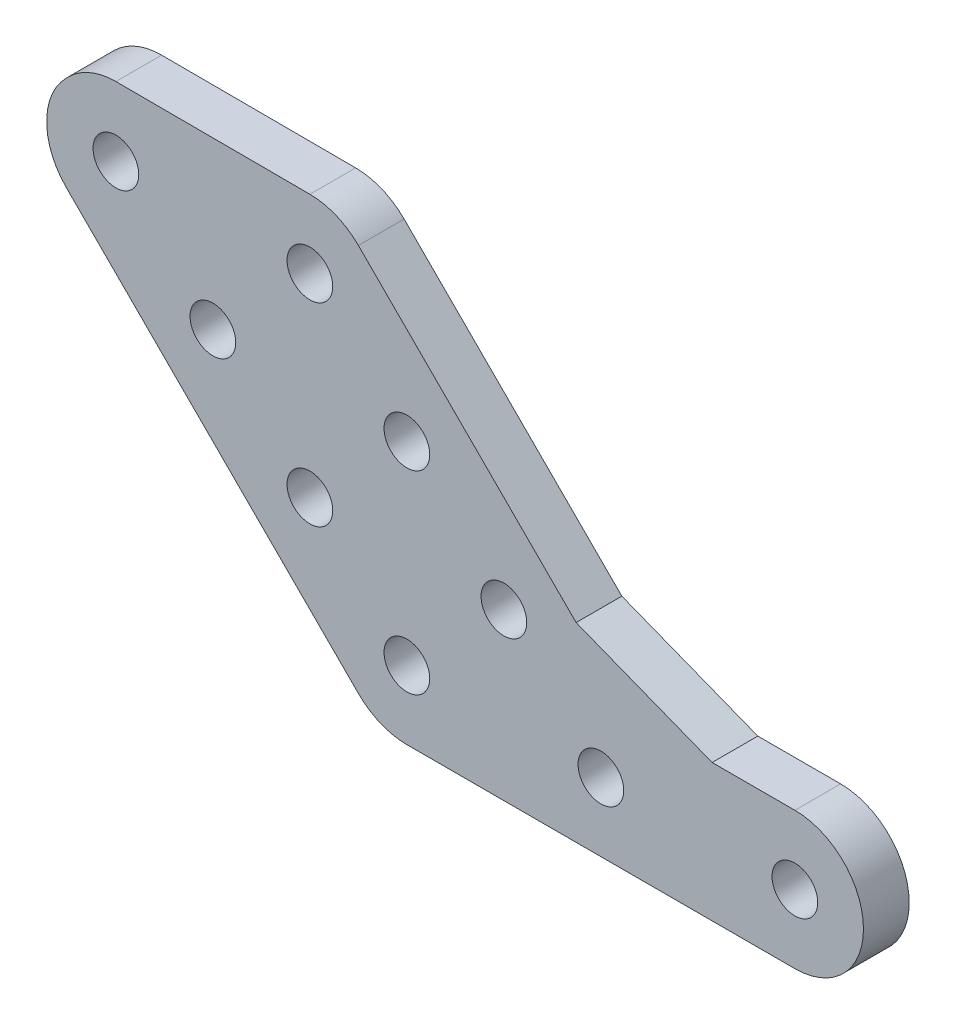
ISO-10303-21;
HEADER;
FILE_DESCRIPTION(('STEP AP214'),'2;1');
FILE_NAME('part.step','',(''),(''),'','','');
FILE_SCHEMA(('AUTOMOTIVE_DESIGN { 1 0 10303 214 1 1 1 1 }'));
ENDSEC;
DATA;
#1=APPLICATION_CONTEXT('core data for automotive mechanical design processes');
#2=APPLICATION_PROTOCOL_DEFINITION('international standard','automotive_design',2000,#1);
#3=PRODUCT_CONTEXT('',#1,'mechanical');
#4=PRODUCT('Part','Part','',(#3));
#5=PRODUCT_RELATED_PRODUCT_CATEGORY('part','',(#4));
#6=PRODUCT_DEFINITION_FORMATION('','',#4);
#7=PRODUCT_DEFINITION_CONTEXT('part definition',#1,'design');
#8=PRODUCT_DEFINITION('design','',#6,#7);
#9=PRODUCT_DEFINITION_SHAPE('','',#8);
#10=(LENGTH_UNIT() NAMED_UNIT(*) SI_UNIT(.MILLI.,.METRE.));
#11=(NAMED_UNIT(*) PLANE_ANGLE_UNIT() SI_UNIT($,.RADIAN.));
#12=(NAMED_UNIT(*) SI_UNIT($,.STERADIAN.) SOLID_ANGLE_UNIT());
#13=UNCERTAINTY_MEASURE_WITH_UNIT(LENGTH_MEASURE(1.E-05),#10,'distance_accuracy_value','');
#14=(GEOMETRIC_REPRESENTATION_CONTEXT(3) GLOBAL_UNCERTAINTY_ASSIGNED_CONTEXT((#13)) GLOBAL_UNIT_ASSIGNED_CONTEXT((#10,
#11,#12)) REPRESENTATION_CONTEXT('',''));
#15=CARTESIAN_POINT('',(0.,0.,0.));
#16=DIRECTION('',(0.,0.,1.));
#17=DIRECTION('',(1.,0.,0.));
#18=AXIS2_PLACEMENT_3D('',#15,#16,#17);
#19=CARTESIAN_POINT('',(237.5387643673,237.5387643673,3.));
#20=DIRECTION('',(0.707106781186548,0.707106781186547,0.));
#21=DIRECTION('',(-0.707106781186547,0.707106781186548,0.));
#22=AXIS2_PLACEMENT_3D('',#19,#20,#21);
#23=PLANE('',#22);
#24=DIRECTION('',(0.707106781186547,-0.707106781186548,0.));
#25=VECTOR('',#24,1.);
#26=CARTESIAN_POINT('',(237.5387643673,237.5387643673,0.));
#27=LINE('',#26,#25);
#28=CARTESIAN_POINT('',(169.9753318993,305.1021968353,0.));
#29=VERTEX_POINT('',#28);
#30=CARTESIAN_POINT('',(184.260234476,290.8172942586,0.));
#31=VERTEX_POINT('',#30);
#32=EDGE_CURVE('E178',#29,#31,#27,.T.);
#33=ORIENTED_EDGE('',*,*,#32,.F.);
#34=DIRECTION('',(0.,0.,-1.));
#35=VECTOR('',#34,1.);
#36=CARTESIAN_POINT('',(169.9753318993,305.1021968353,3.));
#37=LINE('',#36,#35);
#38=CARTESIAN_POINT('',(169.9753318993,305.1021968353,3.));
#39=VERTEX_POINT('',#38);
#40=EDGE_CURVE('E11',#39,#29,#37,.T.);
#41=ORIENTED_EDGE('',*,*,#40,.F.);
#42=DIRECTION('',(0.707106781186547,-0.707106781186548,0.));
#43=VECTOR('',#42,1.);
#44=CARTESIAN_POINT('',(237.5387643673,237.5387643673,3.));
#45=LINE('',#44,#43);
#46=CARTESIAN_POINT('',(184.260234476,290.8172942586,3.));
#47=VERTEX_POINT('',#46);
#48=EDGE_CURVE('E251',#39,#47,#45,.T.);
#49=ORIENTED_EDGE('',*,*,#48,.T.);
#50=DIRECTION('',(0.,0.,-1.));
#51=VECTOR('',#50,1.);
#52=CARTESIAN_POINT('',(184.260234476,290.8172942586,3.));
#53=LINE('',#52,#51);
#54=EDGE_CURVE('E50',#47,#31,#53,.T.);
#55=ORIENTED_EDGE('',*,*,#54,.T.);
#56=EDGE_LOOP('',(#33,#41,#49,#55));
#57=FACE_BOUND('',#56,.T.);
#58=ADVANCED_FACE('F33',(#57),#23,.T.);
#59=CARTESIAN_POINT('',(166.7933513839,301.92021632,3.));
#60=DIRECTION('',(0.,0.,-1.));
#61=DIRECTION('',(-1.,0.,0.));
#62=AXIS2_PLACEMENT_3D('',#59,#60,#61);
#63=CYLINDRICAL_SURFACE('',#62,4.50000000000745);
#64=CARTESIAN_POINT('',(166.7933513839,301.92021632,0.));
#65=DIRECTION('',(0.,0.,1.));
#66=DIRECTION('',(1.,0.,0.));
#67=AXIS2_PLACEMENT_3D('',#64,#65,#66);
#68=CIRCLE('',#67,4.50000000000745);
#69=CARTESIAN_POINT('',(166.7933513839,306.42021632,0.));
#70=VERTEX_POINT('',#69);
#71=EDGE_CURVE('E180',#29,#70,#68,.T.);
#72=ORIENTED_EDGE('',*,*,#71,.T.);
#73=DIRECTION('',(0.,0.,-1.));
#74=VECTOR('',#73,1.);
#75=CARTESIAN_POINT('',(166.7933513839,306.42021632,3.));
#76=LINE('',#75,#74);
#77=CARTESIAN_POINT('',(166.7933513839,306.42021632,3.));
#78=VERTEX_POINT('',#77);
#79=EDGE_CURVE('E42',#78,#70,#76,.T.);
#80=ORIENTED_EDGE('',*,*,#79,.F.);
#81=CARTESIAN_POINT('',(166.7933513839,301.92021632,3.));
#82=DIRECTION('',(0.,0.,1.));
#83=DIRECTION('',(1.,0.,0.));
#84=AXIS2_PLACEMENT_3D('',#81,#82,#83);
#85=CIRCLE('',#84,4.50000000000745);
#86=EDGE_CURVE('E249',#39,#78,#85,.T.);
#87=ORIENTED_EDGE('',*,*,#86,.F.);
#88=ORIENTED_EDGE('',*,*,#40,.T.);
#89=EDGE_LOOP('',(#72,#80,#87,#88));
#90=FACE_BOUND('',#89,.T.);
#91=ADVANCED_FACE('F234',(#90),#63,.T.);
#92=CARTESIAN_POINT('',(0.998960396912358,306.959772462154,3.));
#93=DIRECTION('',(0.00325435186176916,0.999994704582959,0.));
#94=DIRECTION('',(-0.999994704582959,0.00325435186176916,0.));
#95=AXIS2_PLACEMENT_3D('',#92,#93,#94);
#96=PLANE('',#95);
#97=DIRECTION('',(0.999994704582959,-0.00325435186176916,0.));
#98=VECTOR('',#97,1.);
#99=CARTESIAN_POINT('',(0.998960396912358,306.959772462154,0.));
#100=LINE('',#99,#98);
#101=CARTESIAN_POINT('',(154.0654293226,306.4616376762,0.));
#102=VERTEX_POINT('',#101);
#103=EDGE_CURVE('E183',#102,#70,#100,.T.);
#104=ORIENTED_EDGE('',*,*,#103,.F.);
#105=DIRECTION('',(0.,0.,-1.));
#106=VECTOR('',#105,1.);
#107=CARTESIAN_POINT('',(154.0654293226,306.4616376762,3.));
#108=LINE('',#107,#106);
#109=CARTESIAN_POINT('',(154.0654293226,306.4616376762,3.));
#110=VERTEX_POINT('',#109);
#111=EDGE_CURVE('E224',#110,#102,#108,.T.);
#112=ORIENTED_EDGE('',*,*,#111,.F.);
#113=DIRECTION('',(0.999994704582959,-0.00325435186176916,0.));
#114=VECTOR('',#113,1.);
#115=CARTESIAN_POINT('',(0.998960396912358,306.959772462154,3.));
#116=LINE('',#115,#114);
#117=EDGE_CURVE('E231',#110,#78,#116,.T.);
#118=ORIENTED_EDGE('',*,*,#117,.T.);
#119=ORIENTED_EDGE('',*,*,#79,.T.);
#120=EDGE_LOOP('',(#104,#112,#118,#119));
#121=FACE_BOUND('',#120,.T.);
#122=ADVANCED_FACE('F229',(#121),#96,.T.);
#123=CARTESIAN_POINT('',(154.065429322443,302.061637676201,3.));
#124=DIRECTION('',(0.,0.,-1.));
#125=DIRECTION('',(-1.,0.,0.));
#126=AXIS2_PLACEMENT_3D('',#123,#124,#125);
#127=CYLINDRICAL_SURFACE('',#126,4.4000000000001);
#128=CARTESIAN_POINT('',(154.065429322443,302.061637676201,0.));
#129=DIRECTION('',(0.,0.,1.));
#130=DIRECTION('',(1.,0.,0.));
#131=AXIS2_PLACEMENT_3D('',#128,#129,#130);
#132=CIRCLE('',#131,4.4000000000001);
#133=CARTESIAN_POINT('',(150.9541594853,305.1729075135,0.));
#134=VERTEX_POINT('',#133);
#135=EDGE_CURVE('E186',#102,#134,#132,.T.);
#136=ORIENTED_EDGE('',*,*,#135,.T.);
#137=DIRECTION('',(0.,0.,-1.));
#138=VECTOR('',#137,1.);
#139=CARTESIAN_POINT('',(150.9541594853,305.1729075135,3.));
#140=LINE('',#139,#138);
#141=CARTESIAN_POINT('',(150.9541594853,305.1729075135,3.));
#142=VERTEX_POINT('',#141);
#143=EDGE_CURVE('E222',#142,#134,#140,.T.);
#144=ORIENTED_EDGE('',*,*,#143,.F.);
#145=CARTESIAN_POINT('',(154.065429322443,302.061637676201,3.));
#146=DIRECTION('',(0.,0.,1.));
#147=DIRECTION('',(1.,0.,0.));
#148=AXIS2_PLACEMENT_3D('',#145,#146,#147);
#149=CIRCLE('',#148,4.4000000000001);
#150=EDGE_CURVE('E245',#110,#142,#149,.T.);
#151=ORIENTED_EDGE('',*,*,#150,.F.);
#152=ORIENTED_EDGE('',*,*,#111,.T.);
#153=EDGE_LOOP('',(#136,#144,#151,#152));
#154=FACE_BOUND('',#153,.T.);
#155=ADVANCED_FACE('F242',(#154),#127,.T.);
#156=CARTESIAN_POINT('',(-77.1093739607575,77.1093739062614,3.));
#157=DIRECTION('',(-0.707106781436417,0.707106780936678,0.));
#158=DIRECTION('',(-0.707106780936678,-0.707106781436417,0.));
#159=AXIS2_PLACEMENT_3D('',#156,#157,#158);
#160=PLANE('',#159);
#161=DIRECTION('',(0.707106780936678,0.707106781436417,0.));
#162=VECTOR('',#161,1.);
#163=CARTESIAN_POINT('',(-77.1093739607575,77.1093739062614,0.));
#164=LINE('',#163,#162);
#165=CARTESIAN_POINT('',(150.8127381291,305.0314861572,0.));
#166=VERTEX_POINT('',#165);
#167=EDGE_CURVE('E189',#166,#134,#164,.T.);
#168=ORIENTED_EDGE('',*,*,#167,.F.);
#169=DIRECTION('',(0.,0.,-1.));
#170=VECTOR('',#169,1.);
#171=CARTESIAN_POINT('',(150.8127381291,305.0314861572,3.));
#172=LINE('',#171,#170);
#173=CARTESIAN_POINT('',(150.8127381291,305.0314861572,3.));
#174=VERTEX_POINT('',#173);
#175=EDGE_CURVE('E220',#174,#166,#172,.T.);
#176=ORIENTED_EDGE('',*,*,#175,.F.);
#177=DIRECTION('',(0.707106780936678,0.707106781436417,0.));
#178=VECTOR('',#177,1.);
#179=CARTESIAN_POINT('',(-77.1093739607575,77.1093739062614,3.));
#180=LINE('',#179,#178);
#181=EDGE_CURVE('E247',#174,#142,#180,.T.);
#182=ORIENTED_EDGE('',*,*,#181,.T.);
#183=ORIENTED_EDGE('',*,*,#143,.T.);
#184=EDGE_LOOP('',(#168,#176,#182,#183));
#185=FACE_BOUND('',#184,.T.);
#186=ADVANCED_FACE('F465',(#185),#160,.T.);
#187=CARTESIAN_POINT('',(153.924007966342,301.92021632,3.));
#188=DIRECTION('',(0.,0.,-1.));
#189=DIRECTION('',(-1.,0.,0.));
#190=AXIS2_PLACEMENT_3D('',#187,#188,#189);
#191=CYLINDRICAL_SURFACE('',#190,4.40000000000007);
#192=CARTESIAN_POINT('',(153.924007966342,301.92021632,0.));
#193=DIRECTION('',(0.,0.,1.));
#194=DIRECTION('',(1.,0.,0.));
#195=AXIS2_PLACEMENT_3D('',#192,#193,#194);
#196=CIRCLE('',#195,4.40000000000007);
#197=CARTESIAN_POINT('',(150.8127381291,298.8089464828,0.));
#198=VERTEX_POINT('',#197);
#199=EDGE_CURVE('E192',#166,#198,#196,.T.);
#200=ORIENTED_EDGE('',*,*,#199,.T.);
#201=DIRECTION('',(0.,0.,-1.));
#202=VECTOR('',#201,1.);
#203=CARTESIAN_POINT('',(150.8127381291,298.8089464828,3.));
#204=LINE('',#203,#202);
#205=CARTESIAN_POINT('',(150.8127381291,298.8089464828,3.));
#206=VERTEX_POINT('',#205);
#207=EDGE_CURVE('E218',#206,#198,#204,.T.);
#208=ORIENTED_EDGE('',*,*,#207,.F.);
#209=CARTESIAN_POINT('',(153.924007966342,301.92021632,3.));
#210=DIRECTION('',(0.,0.,1.));
#211=DIRECTION('',(1.,0.,0.));
#212=AXIS2_PLACEMENT_3D('',#209,#210,#211);
#213=CIRCLE('',#212,4.40000000000007);
#214=EDGE_CURVE('E256',#174,#206,#213,.T.);
#215=ORIENTED_EDGE('',*,*,#214,.F.);
#216=ORIENTED_EDGE('',*,*,#175,.T.);
#217=EDGE_LOOP('',(#200,#208,#215,#216));
#218=FACE_BOUND('',#217,.T.);
#219=ADVANCED_FACE('F455',(#218),#191,.T.);
#220=CARTESIAN_POINT('',(224.81084230595,224.81084230595,3.));
#221=DIRECTION('',(-0.707106781186548,-0.707106781186547,0.));
#222=DIRECTION('',(0.707106781186547,-0.707106781186548,0.));
#223=AXIS2_PLACEMENT_3D('',#220,#221,#222);
#224=PLANE('',#223);
#225=DIRECTION('',(-0.707106781186547,0.707106781186548,0.));
#226=VECTOR('',#225,1.);
#227=CARTESIAN_POINT('',(224.81084230595,224.81084230595,0.));
#228=LINE('',#227,#226);
#229=CARTESIAN_POINT('',(169.9753318993,279.6463527126,0.));
#230=VERTEX_POINT('',#229);
#231=EDGE_CURVE('E195',#230,#198,#228,.T.);
#232=ORIENTED_EDGE('',*,*,#231,.F.);
#233=DIRECTION('',(0.,0.,-1.));
#234=VECTOR('',#233,1.);
#235=CARTESIAN_POINT('',(169.9753318993,279.6463527126,3.));
#236=LINE('',#235,#234);
#237=CARTESIAN_POINT('',(169.9753318993,279.6463527126,3.));
#238=VERTEX_POINT('',#237);
#239=EDGE_CURVE('E216',#238,#230,#236,.T.);
#240=ORIENTED_EDGE('',*,*,#239,.F.);
#241=DIRECTION('',(-0.707106781186547,0.707106781186548,0.));
#242=VECTOR('',#241,1.);
#243=CARTESIAN_POINT('',(224.81084230595,224.81084230595,3.));
#244=LINE('',#243,#242);
#245=EDGE_CURVE('E258',#238,#206,#244,.T.);
#246=ORIENTED_EDGE('',*,*,#245,.T.);
#247=ORIENTED_EDGE('',*,*,#207,.T.);
#248=EDGE_LOOP('',(#232,#240,#246,#247));
#249=FACE_BOUND('',#248,.T.);
#250=ADVANCED_FACE('F445',(#249),#224,.T.);
#251=CARTESIAN_POINT('',(173.1573124146,282.828333228,3.));
#252=DIRECTION('',(0.,0.,-1.));
#253=DIRECTION('',(-1.,0.,0.));
#254=AXIS2_PLACEMENT_3D('',#251,#252,#253);
#255=CYLINDRICAL_SURFACE('',#254,4.50000000000746);
#256=CARTESIAN_POINT('',(173.1573124146,282.828333228,0.));
#257=DIRECTION('',(0.,0.,1.));
#258=DIRECTION('',(1.,0.,0.));
#259=AXIS2_PLACEMENT_3D('',#256,#257,#258);
#260=CIRCLE('',#259,4.50000000000746);
#261=CARTESIAN_POINT('',(173.1573124146,278.328333228,0.));
#262=VERTEX_POINT('',#261);
#263=EDGE_CURVE('E198',#230,#262,#260,.T.);
#264=ORIENTED_EDGE('',*,*,#263,.T.);
#265=DIRECTION('',(0.,0.,-1.));
#266=VECTOR('',#265,1.);
#267=CARTESIAN_POINT('',(173.1573124146,278.328333228,3.));
#268=LINE('',#267,#266);
#269=CARTESIAN_POINT('',(173.1573124146,278.328333228,3.));
#270=VERTEX_POINT('',#269);
#271=EDGE_CURVE('E214',#270,#262,#268,.T.);
#272=ORIENTED_EDGE('',*,*,#271,.F.);
#273=CARTESIAN_POINT('',(173.1573124146,282.828333228,3.));
#274=DIRECTION('',(0.,0.,1.));
#275=DIRECTION('',(1.,0.,0.));
#276=AXIS2_PLACEMENT_3D('',#273,#274,#275);
#277=CIRCLE('',#276,4.50000000000746);
#278=EDGE_CURVE('E261',#238,#270,#277,.T.);
#279=ORIENTED_EDGE('',*,*,#278,.F.);
#280=ORIENTED_EDGE('',*,*,#239,.T.);
#281=EDGE_LOOP('',(#264,#272,#279,#280));
#282=FACE_BOUND('',#281,.T.);
#283=ADVANCED_FACE('F436',(#282),#255,.T.);
#284=CARTESIAN_POINT('',(0.,278.328333228,3.));
#285=DIRECTION('',(0.,-1.,0.));
#286=DIRECTION('',(0.,0.,-1.));
#287=AXIS2_PLACEMENT_3D('',#284,#285,#286);
#288=PLANE('',#287);
#289=DIRECTION('',(-1.,0.,0.));
#290=VECTOR('',#289,1.);
#291=CARTESIAN_POINT('',(0.,278.328333228,0.));
#292=LINE('',#291,#290);
#293=CARTESIAN_POINT('',(198.6131565373,278.328333228,0.));
#294=VERTEX_POINT('',#293);
#295=EDGE_CURVE('E201',#294,#262,#292,.T.);
#296=ORIENTED_EDGE('',*,*,#295,.F.);
#297=DIRECTION('',(0.,0.,-1.));
#298=VECTOR('',#297,1.);
#299=CARTESIAN_POINT('',(198.6131565373,278.328333228,3.));
#300=LINE('',#299,#298);
#301=CARTESIAN_POINT('',(198.6131565373,278.328333228,3.));
#302=VERTEX_POINT('',#301);
#303=EDGE_CURVE('E143',#302,#294,#300,.T.);
#304=ORIENTED_EDGE('',*,*,#303,.F.);
#305=DIRECTION('',(-1.,0.,0.));
#306=VECTOR('',#305,1.);
#307=CARTESIAN_POINT('',(0.,278.328333228,3.));
#308=LINE('',#307,#306);
#309=EDGE_CURVE('E133',#302,#270,#308,.T.);
#310=ORIENTED_EDGE('',*,*,#309,.T.);
#311=ORIENTED_EDGE('',*,*,#271,.T.);
#312=EDGE_LOOP('',(#296,#304,#310,#311));
#313=FACE_BOUND('',#312,.T.);
#314=ADVANCED_FACE('F264',(#313),#288,.T.);
#315=CARTESIAN_POINT('',(198.6131565373,282.828333228,3.));
#316=DIRECTION('',(0.,0.,-1.));
#317=DIRECTION('',(-1.,0.,0.));
#318=AXIS2_PLACEMENT_3D('',#315,#316,#317);
#319=CYLINDRICAL_SURFACE('',#318,4.49999999999998);
#320=CARTESIAN_POINT('',(198.6131565373,282.828333228,0.));
#321=DIRECTION('',(0.,0.,1.));
#322=DIRECTION('',(1.,0.,0.));
#323=AXIS2_PLACEMENT_3D('',#320,#321,#322);
#324=CIRCLE('',#323,4.49999999999998);
#325=CARTESIAN_POINT('',(198.6131565373,287.328333228,0.));
#326=VERTEX_POINT('',#325);
#327=EDGE_CURVE('E140',#294,#326,#324,.T.);
#328=ORIENTED_EDGE('',*,*,#327,.T.);
#329=DIRECTION('',(0.,0.,-1.));
#330=VECTOR('',#329,1.);
#331=CARTESIAN_POINT('',(198.6131565373,287.328333228,3.));
#332=LINE('',#331,#330);
#333=CARTESIAN_POINT('',(198.6131565373,287.328333228,3.));
#334=VERTEX_POINT('',#333);
#335=EDGE_CURVE('E137',#334,#326,#332,.T.);
#336=ORIENTED_EDGE('',*,*,#335,.F.);
#337=CARTESIAN_POINT('',(198.6131565373,282.828333228,3.));
#338=DIRECTION('',(0.,0.,1.));
#339=DIRECTION('',(1.,0.,0.));
#340=AXIS2_PLACEMENT_3D('',#337,#338,#339);
#341=CIRCLE('',#340,4.49999999999998);
#342=EDGE_CURVE('E125',#302,#334,#341,.T.);
#343=ORIENTED_EDGE('',*,*,#342,.F.);
#344=ORIENTED_EDGE('',*,*,#303,.T.);
#345=EDGE_LOOP('',(#328,#336,#343,#344));
#346=FACE_BOUND('',#345,.T.);
#347=ADVANCED_FACE('F138',(#346),#319,.T.);
#348=CARTESIAN_POINT('',(0.,287.328333228,3.));
#349=DIRECTION('',(0.,1.,0.));
#350=DIRECTION('',(0.,0.,1.));
#351=AXIS2_PLACEMENT_3D('',#348,#349,#350);
#352=PLANE('',#351);
#353=DIRECTION('',(1.,0.,0.));
#354=VECTOR('',#353,1.);
#355=CARTESIAN_POINT('',(0.,287.328333228,0.));
#356=LINE('',#355,#354);
#357=CARTESIAN_POINT('',(193.181176022,287.328333228,0.));
#358=VERTEX_POINT('',#357);
#359=EDGE_CURVE('E205',#358,#326,#356,.T.);
#360=ORIENTED_EDGE('',*,*,#359,.F.);
#361=DIRECTION('',(0.,0.,-1.));
#362=VECTOR('',#361,1.);
#363=CARTESIAN_POINT('',(193.181176022,287.328333228,3.));
#364=LINE('',#363,#362);
#365=CARTESIAN_POINT('',(193.181176022,287.328333228,3.));
#366=VERTEX_POINT('',#365);
#367=EDGE_CURVE('E87',#366,#358,#364,.T.);
#368=ORIENTED_EDGE('',*,*,#367,.F.);
#369=DIRECTION('',(1.,0.,0.));
#370=VECTOR('',#369,1.);
#371=CARTESIAN_POINT('',(0.,287.328333228,3.));
#372=LINE('',#371,#370);
#373=EDGE_CURVE('E131',#366,#334,#372,.T.);
#374=ORIENTED_EDGE('',*,*,#373,.T.);
#375=ORIENTED_EDGE('',*,*,#335,.T.);
#376=EDGE_LOOP('',(#360,#368,#374,#375));
#377=FACE_BOUND('',#376,.T.);
#378=ADVANCED_FACE('F145',(#377),#352,.T.);
#379=CARTESIAN_POINT('',(179.5212734453,289.1922942586,3.));
#380=DIRECTION('',(0.,0.,-1.));
#381=DIRECTION('',(-1.,0.,0.));
#382=AXIS2_PLACEMENT_3D('',#379,#380,#381);
#383=CYLINDRICAL_SURFACE('',#382,1.5);
#384=CARTESIAN_POINT('',(179.5212734453,289.1922942586,3.));
#385=DIRECTION('',(0.,0.,1.));
#386=DIRECTION('',(1.,0.,0.));
#387=AXIS2_PLACEMENT_3D('',#384,#385,#386);
#388=CIRCLE('',#387,1.5);
#389=CARTESIAN_POINT('',(181.0212734453,289.1922942586,3.));
#390=VERTEX_POINT('',#389);
#391=EDGE_CURVE('E534',#390,#390,#388,.T.);
#392=ORIENTED_EDGE('',*,*,#391,.T.);
#393=EDGE_LOOP('',(#392));
#394=FACE_BOUND('',#393,.T.);
#395=CARTESIAN_POINT('',(179.5212734453,289.1922942586,0.));
#396=DIRECTION('',(0.,0.,1.));
#397=DIRECTION('',(1.,0.,0.));
#398=AXIS2_PLACEMENT_3D('',#395,#396,#397);
#399=CIRCLE('',#398,1.5);
#400=CARTESIAN_POINT('',(181.0212734453,289.1922942586,0.));
#401=VERTEX_POINT('',#400);
#402=EDGE_CURVE('E175',#401,#401,#399,.T.);
#403=ORIENTED_EDGE('',*,*,#402,.F.);
#404=EDGE_LOOP('',(#403));
#405=FACE_BOUND('',#404,.T.);
#406=ADVANCED_FACE('F288',(#394,#405),#383,.F.);
#407=CARTESIAN_POINT('',(173.1573124146,295.5562552893,3.));
#408=DIRECTION('',(0.,0.,-1.));
#409=DIRECTION('',(-1.,0.,0.));
#410=AXIS2_PLACEMENT_3D('',#407,#408,#409);
#411=CYLINDRICAL_SURFACE('',#410,1.5);
#412=CARTESIAN_POINT('',(173.1573124146,295.5562552893,3.));
#413=DIRECTION('',(0.,0.,1.));
#414=DIRECTION('',(1.,0.,0.));
#415=AXIS2_PLACEMENT_3D('',#412,#413,#414);
#416=CIRCLE('',#415,1.5);
#417=CARTESIAN_POINT('',(174.6573124146,295.5562552893,3.));
#418=VERTEX_POINT('',#417);
#419=EDGE_CURVE('E531',#418,#418,#416,.T.);
#420=ORIENTED_EDGE('',*,*,#419,.T.);
#421=EDGE_LOOP('',(#420));
#422=FACE_BOUND('',#421,.T.);
#423=CARTESIAN_POINT('',(173.1573124146,295.5562552893,0.));
#424=DIRECTION('',(0.,0.,1.));
#425=DIRECTION('',(1.,0.,0.));
#426=AXIS2_PLACEMENT_3D('',#423,#424,#425);
#427=CIRCLE('',#426,1.5);
#428=CARTESIAN_POINT('',(174.6573124146,295.5562552893,0.));
#429=VERTEX_POINT('',#428);
#430=EDGE_CURVE('E172',#429,#429,#427,.T.);
#431=ORIENTED_EDGE('',*,*,#430,.F.);
#432=EDGE_LOOP('',(#431));
#433=FACE_BOUND('',#432,.T.);
#434=ADVANCED_FACE('F291',(#422,#433),#411,.F.);
#435=CARTESIAN_POINT('',(166.7933513839,301.92021632,3.));
#436=DIRECTION('',(0.,0.,-1.));
#437=DIRECTION('',(-1.,0.,0.));
#438=AXIS2_PLACEMENT_3D('',#435,#436,#437);
#439=CYLINDRICAL_SURFACE('',#438,1.5);
#440=CARTESIAN_POINT('',(166.7933513839,301.92021632,3.));
#441=DIRECTION('',(0.,0.,1.));
#442=DIRECTION('',(1.,0.,0.));
#443=AXIS2_PLACEMENT_3D('',#440,#441,#442);
#444=CIRCLE('',#443,1.5);
#445=CARTESIAN_POINT('',(168.2933513839,301.92021632,3.));
#446=VERTEX_POINT('',#445);
#447=EDGE_CURVE('E528',#446,#446,#444,.T.);
#448=ORIENTED_EDGE('',*,*,#447,.T.);
#449=EDGE_LOOP('',(#448));
#450=FACE_BOUND('',#449,.T.);
#451=CARTESIAN_POINT('',(166.7933513839,301.92021632,0.));
#452=DIRECTION('',(0.,0.,1.));
#453=DIRECTION('',(1.,0.,0.));
#454=AXIS2_PLACEMENT_3D('',#451,#452,#453);
#455=CIRCLE('',#454,1.5);
#456=CARTESIAN_POINT('',(168.2933513839,301.92021632,0.));
#457=VERTEX_POINT('',#456);
#458=EDGE_CURVE('E169',#457,#457,#455,.T.);
#459=ORIENTED_EDGE('',*,*,#458,.F.);
#460=EDGE_LOOP('',(#459));
#461=FACE_BOUND('',#460,.T.);
#462=ADVANCED_FACE('F295',(#450,#461),#439,.F.);
#463=CARTESIAN_POINT('',(185.885234476,282.828333228,3.));
#464=DIRECTION('',(0.,0.,-1.));
#465=DIRECTION('',(-1.,0.,0.));
#466=AXIS2_PLACEMENT_3D('',#463,#464,#465);
#467=CYLINDRICAL_SURFACE('',#466,1.5);
#468=CARTESIAN_POINT('',(185.885234476,282.828333228,3.));
#469=DIRECTION('',(0.,0.,1.));
#470=DIRECTION('',(1.,0.,0.));
#471=AXIS2_PLACEMENT_3D('',#468,#469,#470);
#472=CIRCLE('',#471,1.5);
#473=CARTESIAN_POINT('',(187.385234476,282.828333228,3.));
#474=VERTEX_POINT('',#473);
#475=EDGE_CURVE('E525',#474,#474,#472,.T.);
#476=ORIENTED_EDGE('',*,*,#475,.T.);
#477=EDGE_LOOP('',(#476));
#478=FACE_BOUND('',#477,.T.);
#479=CARTESIAN_POINT('',(185.885234476,282.828333228,0.));
#480=DIRECTION('',(0.,0.,1.));
#481=DIRECTION('',(1.,0.,0.));
#482=AXIS2_PLACEMENT_3D('',#479,#480,#481);
#483=CIRCLE('',#482,1.5);
#484=CARTESIAN_POINT('',(187.385234476,282.828333228,0.));
#485=VERTEX_POINT('',#484);
#486=EDGE_CURVE('E166',#485,#485,#483,.T.);
#487=ORIENTED_EDGE('',*,*,#486,.F.);
#488=EDGE_LOOP('',(#487));
#489=FACE_BOUND('',#488,.T.);
#490=ADVANCED_FACE('F299',(#478,#489),#467,.F.);
#491=CARTESIAN_POINT('',(198.6131565373,282.828333228,3.));
#492=DIRECTION('',(0.,0.,-1.));
#493=DIRECTION('',(-1.,0.,0.));
#494=AXIS2_PLACEMENT_3D('',#491,#492,#493);
#495=CYLINDRICAL_SURFACE('',#494,1.5);
#496=CARTESIAN_POINT('',(198.6131565373,282.828333228,3.));
#497=DIRECTION('',(0.,0.,1.));
#498=DIRECTION('',(1.,0.,0.));
#499=AXIS2_PLACEMENT_3D('',#496,#497,#498);
#500=CIRCLE('',#499,1.5);
#501=CARTESIAN_POINT('',(200.1131565373,282.828333228,3.));
#502=VERTEX_POINT('',#501);
#503=EDGE_CURVE('E522',#502,#502,#500,.T.);
#504=ORIENTED_EDGE('',*,*,#503,.T.);
#505=EDGE_LOOP('',(#504));
#506=FACE_BOUND('',#505,.T.);
#507=CARTESIAN_POINT('',(198.6131565373,282.828333228,0.));
#508=DIRECTION('',(0.,0.,1.));
#509=DIRECTION('',(1.,0.,0.));
#510=AXIS2_PLACEMENT_3D('',#507,#508,#509);
#511=CIRCLE('',#510,1.5);
#512=CARTESIAN_POINT('',(200.1131565373,282.828333228,0.));
#513=VERTEX_POINT('',#512);
#514=EDGE_CURVE('E163',#513,#513,#511,.T.);
#515=ORIENTED_EDGE('',*,*,#514,.F.);
#516=EDGE_LOOP('',(#515));
#517=FACE_BOUND('',#516,.T.);
#518=ADVANCED_FACE('F303',(#506,#517),#495,.F.);
#519=CARTESIAN_POINT('',(173.1573124146,282.828333228,3.));
#520=DIRECTION('',(0.,0.,-1.));
#521=DIRECTION('',(-1.,0.,0.));
#522=AXIS2_PLACEMENT_3D('',#519,#520,#521);
#523=CYLINDRICAL_SURFACE('',#522,1.5);
#524=CARTESIAN_POINT('',(173.1573124146,282.828333228,3.));
#525=DIRECTION('',(0.,0.,1.));
#526=DIRECTION('',(1.,0.,0.));
#527=AXIS2_PLACEMENT_3D('',#524,#525,#526);
#528=CIRCLE('',#527,1.5);
#529=CARTESIAN_POINT('',(174.6573124146,282.828333228,3.));
#530=VERTEX_POINT('',#529);
#531=EDGE_CURVE('E515',#530,#530,#528,.T.);
#532=ORIENTED_EDGE('',*,*,#531,.T.);
#533=EDGE_LOOP('',(#532));
#534=FACE_BOUND('',#533,.T.);
#535=CARTESIAN_POINT('',(173.1573124146,282.828333228,0.));
#536=DIRECTION('',(0.,0.,1.));
#537=DIRECTION('',(1.,0.,0.));
#538=AXIS2_PLACEMENT_3D('',#535,#536,#537);
#539=CIRCLE('',#538,1.5);
#540=CARTESIAN_POINT('',(174.6573124146,282.828333228,0.));
#541=VERTEX_POINT('',#540);
#542=EDGE_CURVE('E160',#541,#541,#539,.T.);
#543=ORIENTED_EDGE('',*,*,#542,.F.);
#544=EDGE_LOOP('',(#543));
#545=FACE_BOUND('',#544,.T.);
#546=ADVANCED_FACE('F307',(#534,#545),#523,.F.);
#547=CARTESIAN_POINT('',(154.0654293226,301.92021632,3.));
#548=DIRECTION('',(0.,0.,-1.));
#549=DIRECTION('',(-1.,0.,0.));
#550=AXIS2_PLACEMENT_3D('',#547,#548,#549);
#551=CYLINDRICAL_SURFACE('',#550,1.5);
#552=CARTESIAN_POINT('',(154.0654293226,301.92021632,3.));
#553=DIRECTION('',(0.,0.,1.));
#554=DIRECTION('',(1.,0.,0.));
#555=AXIS2_PLACEMENT_3D('',#552,#553,#554);
#556=CIRCLE('',#555,1.5);
#557=CARTESIAN_POINT('',(155.5654293226,301.92021632,3.));
#558=VERTEX_POINT('',#557);
#559=EDGE_CURVE('E512',#558,#558,#556,.T.);
#560=ORIENTED_EDGE('',*,*,#559,.T.);
#561=EDGE_LOOP('',(#560));
#562=FACE_BOUND('',#561,.T.);
#563=CARTESIAN_POINT('',(154.0654293226,301.92021632,0.));
#564=DIRECTION('',(0.,0.,1.));
#565=DIRECTION('',(1.,0.,0.));
#566=AXIS2_PLACEMENT_3D('',#563,#564,#565);
#567=CIRCLE('',#566,1.5);
#568=CARTESIAN_POINT('',(155.5654293226,301.92021632,0.));
#569=VERTEX_POINT('',#568);
#570=EDGE_CURVE('E157',#569,#569,#567,.T.);
#571=ORIENTED_EDGE('',*,*,#570,.F.);
#572=EDGE_LOOP('',(#571));
#573=FACE_BOUND('',#572,.T.);
#574=ADVANCED_FACE('F311',(#562,#573),#551,.F.);
#575=CARTESIAN_POINT('',(166.7933513839,289.1922942586,3.));
#576=DIRECTION('',(0.,0.,-1.));
#577=DIRECTION('',(-1.,0.,0.));
#578=AXIS2_PLACEMENT_3D('',#575,#576,#577);
#579=CYLINDRICAL_SURFACE('',#578,1.5);
#580=CARTESIAN_POINT('',(166.7933513839,289.1922942586,3.));
#581=DIRECTION('',(0.,0.,1.));
#582=DIRECTION('',(1.,0.,0.));
#583=AXIS2_PLACEMENT_3D('',#580,#581,#582);
#584=CIRCLE('',#583,1.5);
#585=CARTESIAN_POINT('',(168.2933513839,289.1922942586,3.));
#586=VERTEX_POINT('',#585);
#587=EDGE_CURVE('E322',#586,#586,#584,.T.);
#588=ORIENTED_EDGE('',*,*,#587,.T.);
#589=EDGE_LOOP('',(#588));
#590=FACE_BOUND('',#589,.T.);
#591=CARTESIAN_POINT('',(166.7933513839,289.1922942586,0.));
#592=DIRECTION('',(0.,0.,1.));
#593=DIRECTION('',(1.,0.,0.));
#594=AXIS2_PLACEMENT_3D('',#591,#592,#593);
#595=CIRCLE('',#594,1.5);
#596=CARTESIAN_POINT('',(168.2933513839,289.1922942586,0.));
#597=VERTEX_POINT('',#596);
#598=EDGE_CURVE('E154',#597,#597,#595,.T.);
#599=ORIENTED_EDGE('',*,*,#598,.F.);
#600=EDGE_LOOP('',(#599));
#601=FACE_BOUND('',#600,.T.);
#602=ADVANCED_FACE('F276',(#590,#601),#579,.F.);
#603=CARTESIAN_POINT('',(160.4293903532,295.5562552893,3.));
#604=DIRECTION('',(0.,0.,-1.));
#605=DIRECTION('',(-1.,0.,0.));
#606=AXIS2_PLACEMENT_3D('',#603,#604,#605);
#607=CYLINDRICAL_SURFACE('',#606,1.5);
#608=CARTESIAN_POINT('',(160.4293903532,295.5562552893,3.));
#609=DIRECTION('',(0.,0.,1.));
#610=DIRECTION('',(1.,0.,0.));
#611=AXIS2_PLACEMENT_3D('',#608,#609,#610);
#612=CIRCLE('',#611,1.5);
#613=CARTESIAN_POINT('',(161.9293903532,295.5562552893,3.));
#614=VERTEX_POINT('',#613);
#615=EDGE_CURVE('E210',#614,#614,#612,.T.);
#616=ORIENTED_EDGE('',*,*,#615,.T.);
#617=EDGE_LOOP('',(#616));
#618=FACE_BOUND('',#617,.T.);
#619=CARTESIAN_POINT('',(160.4293903532,295.5562552893,0.));
#620=DIRECTION('',(0.,0.,1.));
#621=DIRECTION('',(1.,0.,0.));
#622=AXIS2_PLACEMENT_3D('',#619,#620,#621);
#623=CIRCLE('',#622,1.5);
#624=CARTESIAN_POINT('',(161.9293903532,295.5562552893,0.));
#625=VERTEX_POINT('',#624);
#626=EDGE_CURVE('E151',#625,#625,#623,.T.);
#627=ORIENTED_EDGE('',*,*,#626,.F.);
#628=EDGE_LOOP('',(#627));
#629=FACE_BOUND('',#628,.T.);
#630=ADVANCED_FACE('F35',(#618,#629),#607,.F.);
#631=CARTESIAN_POINT('',(123.093872938166,314.739326556276,3.));
#632=DIRECTION('',(0.364232563772633,0.931308026105013,0.));
#633=DIRECTION('',(-0.931308026105013,0.364232563772633,0.));
#634=AXIS2_PLACEMENT_3D('',#631,#632,#633);
#635=PLANE('',#634);
#636=DIRECTION('',(0.931308026105013,-0.364232563772633,0.));
#637=VECTOR('',#636,1.);
#638=CARTESIAN_POINT('',(123.093872938166,314.739326556276,0.));
#639=LINE('',#638,#637);
#640=EDGE_CURVE('E207',#31,#358,#639,.T.);
#641=ORIENTED_EDGE('',*,*,#640,.F.);
#642=ORIENTED_EDGE('',*,*,#54,.F.);
#643=DIRECTION('',(0.931308026105013,-0.364232563772633,0.));
#644=VECTOR('',#643,1.);
#645=CARTESIAN_POINT('',(123.093872938166,314.739326556276,3.));
#646=LINE('',#645,#644);
#647=EDGE_CURVE('E146',#47,#366,#646,.T.);
#648=ORIENTED_EDGE('',*,*,#647,.T.);
#649=ORIENTED_EDGE('',*,*,#367,.T.);
#650=EDGE_LOOP('',(#641,#642,#648,#649));
#651=FACE_BOUND('',#650,.T.);
#652=ADVANCED_FACE('F267',(#651),#635,.T.);
#653=CARTESIAN_POINT('',(0.,0.,3.));
#654=DIRECTION('',(0.,0.,1.));
#655=DIRECTION('',(1.,0.,0.));
#656=AXIS2_PLACEMENT_3D('',#653,#654,#655);
#657=PLANE('',#656);
#658=ORIENTED_EDGE('',*,*,#615,.F.);
#659=EDGE_LOOP('',(#658));
#660=FACE_BOUND('',#659,.T.);
#661=ORIENTED_EDGE('',*,*,#587,.F.);
#662=EDGE_LOOP('',(#661));
#663=FACE_BOUND('',#662,.T.);
#664=ORIENTED_EDGE('',*,*,#559,.F.);
#665=EDGE_LOOP('',(#664));
#666=FACE_BOUND('',#665,.T.);
#667=ORIENTED_EDGE('',*,*,#531,.F.);
#668=EDGE_LOOP('',(#667));
#669=FACE_BOUND('',#668,.T.);
#670=ORIENTED_EDGE('',*,*,#503,.F.);
#671=EDGE_LOOP('',(#670));
#672=FACE_BOUND('',#671,.T.);
#673=ORIENTED_EDGE('',*,*,#475,.F.);
#674=EDGE_LOOP('',(#673));
#675=FACE_BOUND('',#674,.T.);
#676=ORIENTED_EDGE('',*,*,#447,.F.);
#677=EDGE_LOOP('',(#676));
#678=FACE_BOUND('',#677,.T.);
#679=ORIENTED_EDGE('',*,*,#419,.F.);
#680=EDGE_LOOP('',(#679));
#681=FACE_BOUND('',#680,.T.);
#682=ORIENTED_EDGE('',*,*,#391,.F.);
#683=EDGE_LOOP('',(#682));
#684=FACE_BOUND('',#683,.T.);
#685=ORIENTED_EDGE('',*,*,#48,.F.);
#686=ORIENTED_EDGE('',*,*,#86,.T.);
#687=ORIENTED_EDGE('',*,*,#117,.F.);
#688=ORIENTED_EDGE('',*,*,#150,.T.);
#689=ORIENTED_EDGE('',*,*,#181,.F.);
#690=ORIENTED_EDGE('',*,*,#214,.T.);
#691=ORIENTED_EDGE('',*,*,#245,.F.);
#692=ORIENTED_EDGE('',*,*,#278,.T.);
#693=ORIENTED_EDGE('',*,*,#309,.F.);
#694=ORIENTED_EDGE('',*,*,#342,.T.);
#695=ORIENTED_EDGE('',*,*,#373,.F.);
#696=ORIENTED_EDGE('',*,*,#647,.F.);
#697=EDGE_LOOP('',(#685,#686,#687,#688,#689,#690,#691,#692,#693,#694,#695,#696));
#698=FACE_BOUND('',#697,.T.);
#699=ADVANCED_FACE('F128',(#660,#663,#666,#669,#672,#675,#678,#681,#684,#698),#657,.T.);
#700=CARTESIAN_POINT('',(0.,0.,0.));
#701=DIRECTION('',(0.,0.,1.));
#702=DIRECTION('',(1.,0.,0.));
#703=AXIS2_PLACEMENT_3D('',#700,#701,#702);
#704=PLANE('',#703);
#705=ORIENTED_EDGE('',*,*,#626,.T.);
#706=EDGE_LOOP('',(#705));
#707=FACE_BOUND('',#706,.T.);
#708=ORIENTED_EDGE('',*,*,#598,.T.);
#709=EDGE_LOOP('',(#708));
#710=FACE_BOUND('',#709,.T.);
#711=ORIENTED_EDGE('',*,*,#570,.T.);
#712=EDGE_LOOP('',(#711));
#713=FACE_BOUND('',#712,.T.);
#714=ORIENTED_EDGE('',*,*,#542,.T.);
#715=EDGE_LOOP('',(#714));
#716=FACE_BOUND('',#715,.T.);
#717=ORIENTED_EDGE('',*,*,#514,.T.);
#718=EDGE_LOOP('',(#717));
#719=FACE_BOUND('',#718,.T.);
#720=ORIENTED_EDGE('',*,*,#486,.T.);
#721=EDGE_LOOP('',(#720));
#722=FACE_BOUND('',#721,.T.);
#723=ORIENTED_EDGE('',*,*,#458,.T.);
#724=EDGE_LOOP('',(#723));
#725=FACE_BOUND('',#724,.T.);
#726=ORIENTED_EDGE('',*,*,#430,.T.);
#727=EDGE_LOOP('',(#726));
#728=FACE_BOUND('',#727,.T.);
#729=ORIENTED_EDGE('',*,*,#402,.T.);
#730=EDGE_LOOP('',(#729));
#731=FACE_BOUND('',#730,.T.);
#732=ORIENTED_EDGE('',*,*,#32,.T.);
#733=ORIENTED_EDGE('',*,*,#640,.T.);
#734=ORIENTED_EDGE('',*,*,#359,.T.);
#735=ORIENTED_EDGE('',*,*,#327,.F.);
#736=ORIENTED_EDGE('',*,*,#295,.T.);
#737=ORIENTED_EDGE('',*,*,#263,.F.);
#738=ORIENTED_EDGE('',*,*,#231,.T.);
#739=ORIENTED_EDGE('',*,*,#199,.F.);
#740=ORIENTED_EDGE('',*,*,#167,.T.);
#741=ORIENTED_EDGE('',*,*,#135,.F.);
#742=ORIENTED_EDGE('',*,*,#103,.T.);
#743=ORIENTED_EDGE('',*,*,#71,.F.);
#744=EDGE_LOOP('',(#732,#733,#734,#735,#736,#737,#738,#739,#740,#741,#742,#743));
#745=FACE_BOUND('',#744,.T.);
#746=ADVANCED_FACE('F237',(#707,#710,#713,#716,#719,#722,#725,#728,#731,#745),#704,.F.);
#747=CLOSED_SHELL('',(#58,#91,#122,#155,#186,#219,#250,#283,#314,#347,#378,#406,#434,#462,#490,
#518,#546,#574,#602,#630,#652,#699,#746));
#748=MANIFOLD_SOLID_BREP('B2',#747);
#749=ADVANCED_BREP_SHAPE_REPRESENTATION('',(#18,#748),#14);
#750=SHAPE_DEFINITION_REPRESENTATION(#9,#749);
ENDSEC;
END-ISO-10303-21;
